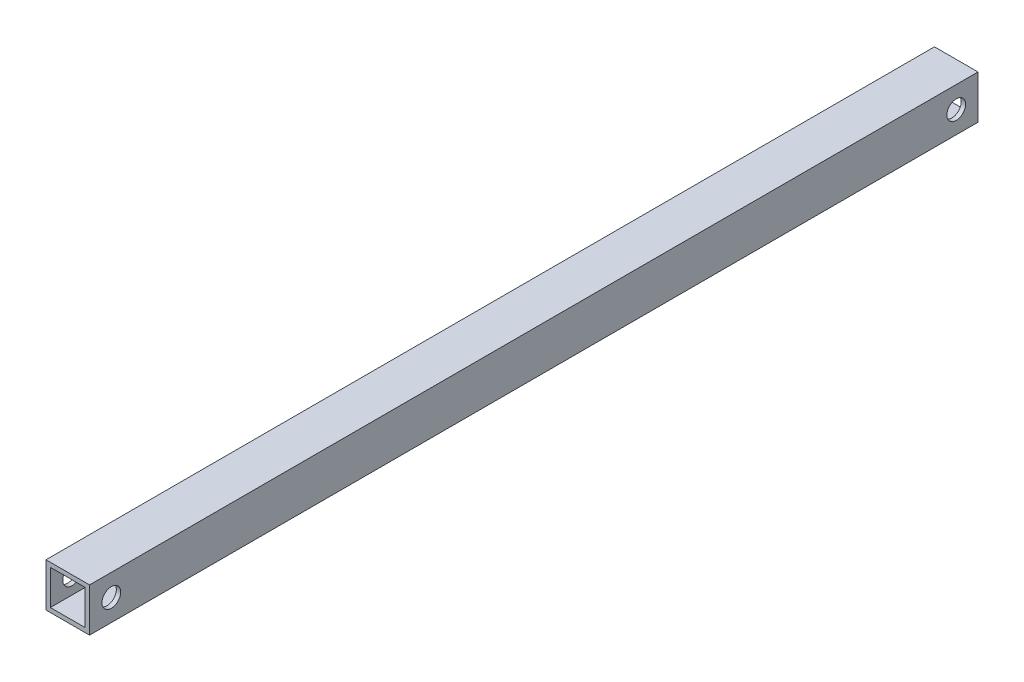
ISO-10303-21;
HEADER;
FILE_DESCRIPTION(('STEP AP214'),'2;1');
FILE_NAME('part.step','',(''),(''),'','','');
FILE_SCHEMA(('AUTOMOTIVE_DESIGN { 1 0 10303 214 1 1 1 1 }'));
ENDSEC;
DATA;
#1=APPLICATION_CONTEXT('core data for automotive mechanical design processes');
#2=APPLICATION_PROTOCOL_DEFINITION('international standard','automotive_design',2000,#1);
#3=PRODUCT_CONTEXT('',#1,'mechanical');
#4=PRODUCT('Part','Part','',(#3));
#5=PRODUCT_RELATED_PRODUCT_CATEGORY('part','',(#4));
#6=PRODUCT_DEFINITION_FORMATION('','',#4);
#7=PRODUCT_DEFINITION_CONTEXT('part definition',#1,'design');
#8=PRODUCT_DEFINITION('design','',#6,#7);
#9=PRODUCT_DEFINITION_SHAPE('','',#8);
#10=(LENGTH_UNIT() NAMED_UNIT(*) SI_UNIT(.MILLI.,.METRE.));
#11=(NAMED_UNIT(*) PLANE_ANGLE_UNIT() SI_UNIT($,.RADIAN.));
#12=(NAMED_UNIT(*) SI_UNIT($,.STERADIAN.) SOLID_ANGLE_UNIT());
#13=UNCERTAINTY_MEASURE_WITH_UNIT(LENGTH_MEASURE(1.E-05),#10,'distance_accuracy_value','');
#14=(GEOMETRIC_REPRESENTATION_CONTEXT(3) GLOBAL_UNCERTAINTY_ASSIGNED_CONTEXT((#13)) GLOBAL_UNIT_ASSIGNED_CONTEXT((#10,
#11,#12)) REPRESENTATION_CONTEXT('',''));
#15=CARTESIAN_POINT('',(0.,0.,0.));
#16=DIRECTION('',(0.,0.,1.));
#17=DIRECTION('',(1.,0.,0.));
#18=AXIS2_PLACEMENT_3D('',#15,#16,#17);
#19=CARTESIAN_POINT('',(0.,0.,204.));
#20=DIRECTION('',(0.,0.,1.));
#21=DIRECTION('',(1.,0.,0.));
#22=AXIS2_PLACEMENT_3D('',#19,#20,#21);
#23=PLANE('',#22);
#24=DIRECTION('',(0.,1.,0.));
#25=VECTOR('',#24,1.);
#26=CARTESIAN_POINT('',(5.,5.,204.));
#27=LINE('',#26,#25);
#28=CARTESIAN_POINT('',(5.,-5.,204.));
#29=VERTEX_POINT('',#28);
#30=CARTESIAN_POINT('',(5.,5.,204.));
#31=VERTEX_POINT('',#30);
#32=EDGE_CURVE('E164',#29,#31,#27,.T.);
#33=ORIENTED_EDGE('',*,*,#32,.T.);
#34=DIRECTION('',(-1.,0.,0.));
#35=VECTOR('',#34,1.);
#36=CARTESIAN_POINT('',(-5.,5.,204.));
#37=LINE('',#36,#35);
#38=CARTESIAN_POINT('',(-5.,5.,204.));
#39=VERTEX_POINT('',#38);
#40=EDGE_CURVE('E167',#31,#39,#37,.T.);
#41=ORIENTED_EDGE('',*,*,#40,.T.);
#42=DIRECTION('',(0.,-1.,0.));
#43=VECTOR('',#42,1.);
#44=CARTESIAN_POINT('',(-5.,5.,204.));
#45=LINE('',#44,#43);
#46=CARTESIAN_POINT('',(-5.,-5.,204.));
#47=VERTEX_POINT('',#46);
#48=EDGE_CURVE('E170',#39,#47,#45,.T.);
#49=ORIENTED_EDGE('',*,*,#48,.T.);
#50=DIRECTION('',(1.,0.,0.));
#51=VECTOR('',#50,1.);
#52=CARTESIAN_POINT('',(-5.,-5.,204.));
#53=LINE('',#52,#51);
#54=EDGE_CURVE('E172',#47,#29,#53,.T.);
#55=ORIENTED_EDGE('',*,*,#54,.T.);
#56=EDGE_LOOP('',(#33,#41,#49,#55));
#57=FACE_BOUND('',#56,.T.);
#58=DIRECTION('',(-1.,0.,0.));
#59=VECTOR('',#58,1.);
#60=CARTESIAN_POINT('',(-5.,4.,204.));
#61=LINE('',#60,#59);
#62=CARTESIAN_POINT('',(4.,4.,204.));
#63=VERTEX_POINT('',#62);
#64=CARTESIAN_POINT('',(-4.,4.,204.));
#65=VERTEX_POINT('',#64);
#66=EDGE_CURVE('E134',#63,#65,#61,.T.);
#67=ORIENTED_EDGE('',*,*,#66,.F.);
#68=DIRECTION('',(0.,1.,0.));
#69=VECTOR('',#68,1.);
#70=CARTESIAN_POINT('',(4.,5.,204.));
#71=LINE('',#70,#69);
#72=CARTESIAN_POINT('',(4.,-4.,204.));
#73=VERTEX_POINT('',#72);
#74=EDGE_CURVE('E126',#73,#63,#71,.T.);
#75=ORIENTED_EDGE('',*,*,#74,.F.);
#76=DIRECTION('',(1.,0.,0.));
#77=VECTOR('',#76,1.);
#78=CARTESIAN_POINT('',(-5.,-4.,204.));
#79=LINE('',#78,#77);
#80=CARTESIAN_POINT('',(-4.,-4.,204.));
#81=VERTEX_POINT('',#80);
#82=EDGE_CURVE('E148',#81,#73,#79,.T.);
#83=ORIENTED_EDGE('',*,*,#82,.F.);
#84=DIRECTION('',(0.,-1.,0.));
#85=VECTOR('',#84,1.);
#86=CARTESIAN_POINT('',(-4.,5.,204.));
#87=LINE('',#86,#85);
#88=EDGE_CURVE('E146',#65,#81,#87,.T.);
#89=ORIENTED_EDGE('',*,*,#88,.F.);
#90=EDGE_LOOP('',(#67,#75,#83,#89));
#91=FACE_BOUND('',#90,.T.);
#92=ADVANCED_FACE('F59',(#57,#91),#23,.T.);
#93=CARTESIAN_POINT('',(0.,0.,0.));
#94=DIRECTION('',(0.,0.,1.));
#95=DIRECTION('',(1.,0.,0.));
#96=AXIS2_PLACEMENT_3D('',#93,#94,#95);
#97=PLANE('',#96);
#98=DIRECTION('',(0.,1.,0.));
#99=VECTOR('',#98,1.);
#100=CARTESIAN_POINT('',(5.,5.,0.));
#101=LINE('',#100,#99);
#102=CARTESIAN_POINT('',(5.,-5.,0.));
#103=VERTEX_POINT('',#102);
#104=CARTESIAN_POINT('',(5.,5.,0.));
#105=VERTEX_POINT('',#104);
#106=EDGE_CURVE('E142',#103,#105,#101,.T.);
#107=ORIENTED_EDGE('',*,*,#106,.F.);
#108=DIRECTION('',(1.,0.,0.));
#109=VECTOR('',#108,1.);
#110=CARTESIAN_POINT('',(-5.,-5.,0.));
#111=LINE('',#110,#109);
#112=CARTESIAN_POINT('',(-5.,-5.,0.));
#113=VERTEX_POINT('',#112);
#114=EDGE_CURVE('E168',#113,#103,#111,.T.);
#115=ORIENTED_EDGE('',*,*,#114,.F.);
#116=DIRECTION('',(0.,-1.,0.));
#117=VECTOR('',#116,1.);
#118=CARTESIAN_POINT('',(-5.,5.,0.));
#119=LINE('',#118,#117);
#120=CARTESIAN_POINT('',(-5.,5.,0.));
#121=VERTEX_POINT('',#120);
#122=EDGE_CURVE('E179',#121,#113,#119,.T.);
#123=ORIENTED_EDGE('',*,*,#122,.F.);
#124=DIRECTION('',(-1.,0.,0.));
#125=VECTOR('',#124,1.);
#126=CARTESIAN_POINT('',(-5.,5.,0.));
#127=LINE('',#126,#125);
#128=EDGE_CURVE('E177',#105,#121,#127,.T.);
#129=ORIENTED_EDGE('',*,*,#128,.F.);
#130=EDGE_LOOP('',(#107,#115,#123,#129));
#131=FACE_BOUND('',#130,.T.);
#132=DIRECTION('',(0.,1.,0.));
#133=VECTOR('',#132,1.);
#134=CARTESIAN_POINT('',(4.,5.,0.));
#135=LINE('',#134,#133);
#136=CARTESIAN_POINT('',(4.,-4.,0.));
#137=VERTEX_POINT('',#136);
#138=CARTESIAN_POINT('',(4.,4.,0.));
#139=VERTEX_POINT('',#138);
#140=EDGE_CURVE('E84',#137,#139,#135,.T.);
#141=ORIENTED_EDGE('',*,*,#140,.T.);
#142=DIRECTION('',(-1.,0.,0.));
#143=VECTOR('',#142,1.);
#144=CARTESIAN_POINT('',(-5.,4.,0.));
#145=LINE('',#144,#143);
#146=CARTESIAN_POINT('',(-4.,4.,0.));
#147=VERTEX_POINT('',#146);
#148=EDGE_CURVE('E141',#139,#147,#145,.T.);
#149=ORIENTED_EDGE('',*,*,#148,.T.);
#150=DIRECTION('',(0.,-1.,0.));
#151=VECTOR('',#150,1.);
#152=CARTESIAN_POINT('',(-4.,5.,0.));
#153=LINE('',#152,#151);
#154=CARTESIAN_POINT('',(-4.,-4.,0.));
#155=VERTEX_POINT('',#154);
#156=EDGE_CURVE('E156',#147,#155,#153,.T.);
#157=ORIENTED_EDGE('',*,*,#156,.T.);
#158=DIRECTION('',(1.,0.,0.));
#159=VECTOR('',#158,1.);
#160=CARTESIAN_POINT('',(-5.,-4.,0.));
#161=LINE('',#160,#159);
#162=EDGE_CURVE('E135',#155,#137,#161,.T.);
#163=ORIENTED_EDGE('',*,*,#162,.T.);
#164=EDGE_LOOP('',(#141,#149,#157,#163));
#165=FACE_BOUND('',#164,.T.);
#166=ADVANCED_FACE('F226',(#131,#165),#97,.F.);
#167=CARTESIAN_POINT('',(5.,5.,204.));
#168=DIRECTION('',(-1.,0.,0.));
#169=DIRECTION('',(0.,-1.,0.));
#170=AXIS2_PLACEMENT_3D('',#167,#168,#169);
#171=PLANE('',#170);
#172=CARTESIAN_POINT('',(5.,0.,5.));
#173=DIRECTION('',(1.,0.,0.));
#174=DIRECTION('',(0.,1.,0.));
#175=AXIS2_PLACEMENT_3D('',#172,#173,#174);
#176=CIRCLE('',#175,2.15);
#177=CARTESIAN_POINT('',(5.,2.15,5.));
#178=VERTEX_POINT('',#177);
#179=EDGE_CURVE('E197',#178,#178,#176,.T.);
#180=ORIENTED_EDGE('',*,*,#179,.F.);
#181=EDGE_LOOP('',(#180));
#182=FACE_BOUND('',#181,.T.);
#183=CARTESIAN_POINT('',(5.,0.,199.));
#184=DIRECTION('',(1.,0.,0.));
#185=DIRECTION('',(0.,-1.,0.));
#186=AXIS2_PLACEMENT_3D('',#183,#184,#185);
#187=CIRCLE('',#186,2.15000000000002);
#188=CARTESIAN_POINT('',(5.,-2.15000000000004,199.));
#189=VERTEX_POINT('',#188);
#190=EDGE_CURVE('E207',#189,#189,#187,.T.);
#191=ORIENTED_EDGE('',*,*,#190,.F.);
#192=EDGE_LOOP('',(#191));
#193=FACE_BOUND('',#192,.T.);
#194=ORIENTED_EDGE('',*,*,#106,.T.);
#195=DIRECTION('',(0.,0.,-1.));
#196=VECTOR('',#195,1.);
#197=CARTESIAN_POINT('',(5.,5.,204.));
#198=LINE('',#197,#196);
#199=EDGE_CURVE('E12',#31,#105,#198,.T.);
#200=ORIENTED_EDGE('',*,*,#199,.F.);
#201=ORIENTED_EDGE('',*,*,#32,.F.);
#202=DIRECTION('',(0.,0.,-1.));
#203=VECTOR('',#202,1.);
#204=CARTESIAN_POINT('',(5.,-5.,204.));
#205=LINE('',#204,#203);
#206=EDGE_CURVE('E174',#29,#103,#205,.T.);
#207=ORIENTED_EDGE('',*,*,#206,.T.);
#208=EDGE_LOOP('',(#194,#200,#201,#207));
#209=FACE_BOUND('',#208,.T.);
#210=ADVANCED_FACE('F61',(#182,#193,#209),#171,.F.);
#211=CARTESIAN_POINT('',(-5.,5.,204.));
#212=DIRECTION('',(0.,-1.,0.));
#213=DIRECTION('',(0.,0.,-1.));
#214=AXIS2_PLACEMENT_3D('',#211,#212,#213);
#215=PLANE('',#214);
#216=ORIENTED_EDGE('',*,*,#128,.T.);
#217=DIRECTION('',(0.,0.,-1.));
#218=VECTOR('',#217,1.);
#219=CARTESIAN_POINT('',(-5.,5.,204.));
#220=LINE('',#219,#218);
#221=EDGE_CURVE('E68',#39,#121,#220,.T.);
#222=ORIENTED_EDGE('',*,*,#221,.F.);
#223=ORIENTED_EDGE('',*,*,#40,.F.);
#224=ORIENTED_EDGE('',*,*,#199,.T.);
#225=EDGE_LOOP('',(#216,#222,#223,#224));
#226=FACE_BOUND('',#225,.T.);
#227=ADVANCED_FACE('F252',(#226),#215,.F.);
#228=CARTESIAN_POINT('',(-5.,5.,204.));
#229=DIRECTION('',(1.,0.,0.));
#230=DIRECTION('',(0.,1.,0.));
#231=AXIS2_PLACEMENT_3D('',#228,#229,#230);
#232=PLANE('',#231);
#233=CARTESIAN_POINT('',(-5.,0.,5.));
#234=DIRECTION('',(1.,0.,0.));
#235=DIRECTION('',(0.,1.,0.));
#236=AXIS2_PLACEMENT_3D('',#233,#234,#235);
#237=CIRCLE('',#236,2.15);
#238=CARTESIAN_POINT('',(-5.,2.15,5.));
#239=VERTEX_POINT('',#238);
#240=EDGE_CURVE('E191',#239,#239,#237,.T.);
#241=ORIENTED_EDGE('',*,*,#240,.T.);
#242=EDGE_LOOP('',(#241));
#243=FACE_BOUND('',#242,.T.);
#244=CARTESIAN_POINT('',(-5.,0.,199.));
#245=DIRECTION('',(1.,0.,0.));
#246=DIRECTION('',(0.,-1.,0.));
#247=AXIS2_PLACEMENT_3D('',#244,#245,#246);
#248=CIRCLE('',#247,2.15000000000002);
#249=CARTESIAN_POINT('',(-5.,-2.15000000000004,199.));
#250=VERTEX_POINT('',#249);
#251=EDGE_CURVE('E202',#250,#250,#248,.T.);
#252=ORIENTED_EDGE('',*,*,#251,.T.);
#253=EDGE_LOOP('',(#252));
#254=FACE_BOUND('',#253,.T.);
#255=ORIENTED_EDGE('',*,*,#122,.T.);
#256=DIRECTION('',(0.,0.,-1.));
#257=VECTOR('',#256,1.);
#258=CARTESIAN_POINT('',(-5.,-5.,204.));
#259=LINE('',#258,#257);
#260=EDGE_CURVE('E184',#47,#113,#259,.T.);
#261=ORIENTED_EDGE('',*,*,#260,.F.);
#262=ORIENTED_EDGE('',*,*,#48,.F.);
#263=ORIENTED_EDGE('',*,*,#221,.T.);
#264=EDGE_LOOP('',(#255,#261,#262,#263));
#265=FACE_BOUND('',#264,.T.);
#266=ADVANCED_FACE('F249',(#243,#254,#265),#232,.F.);
#267=CARTESIAN_POINT('',(-5.,-5.,204.));
#268=DIRECTION('',(0.,1.,0.));
#269=DIRECTION('',(0.,0.,1.));
#270=AXIS2_PLACEMENT_3D('',#267,#268,#269);
#271=PLANE('',#270);
#272=ORIENTED_EDGE('',*,*,#114,.T.);
#273=ORIENTED_EDGE('',*,*,#206,.F.);
#274=ORIENTED_EDGE('',*,*,#54,.F.);
#275=ORIENTED_EDGE('',*,*,#260,.T.);
#276=EDGE_LOOP('',(#272,#273,#274,#275));
#277=FACE_BOUND('',#276,.T.);
#278=ADVANCED_FACE('F246',(#277),#271,.F.);
#279=CARTESIAN_POINT('',(4.,5.,204.));
#280=DIRECTION('',(-1.,0.,0.));
#281=DIRECTION('',(0.,-1.,0.));
#282=AXIS2_PLACEMENT_3D('',#279,#280,#281);
#283=PLANE('',#282);
#284=CARTESIAN_POINT('',(4.,0.,5.));
#285=DIRECTION('',(-1.,0.,0.));
#286=DIRECTION('',(0.,-1.,0.));
#287=AXIS2_PLACEMENT_3D('',#284,#285,#286);
#288=CIRCLE('',#287,2.15);
#289=CARTESIAN_POINT('',(4.,-2.15,5.));
#290=VERTEX_POINT('',#289);
#291=EDGE_CURVE('E154',#290,#290,#288,.T.);
#292=ORIENTED_EDGE('',*,*,#291,.F.);
#293=EDGE_LOOP('',(#292));
#294=FACE_BOUND('',#293,.T.);
#295=CARTESIAN_POINT('',(4.,0.,199.));
#296=DIRECTION('',(-1.,0.,0.));
#297=DIRECTION('',(0.,-1.,0.));
#298=AXIS2_PLACEMENT_3D('',#295,#296,#297);
#299=CIRCLE('',#298,2.15000000000002);
#300=CARTESIAN_POINT('',(4.,-2.15000000000004,199.));
#301=VERTEX_POINT('',#300);
#302=EDGE_CURVE('E190',#301,#301,#299,.T.);
#303=ORIENTED_EDGE('',*,*,#302,.F.);
#304=EDGE_LOOP('',(#303));
#305=FACE_BOUND('',#304,.T.);
#306=ORIENTED_EDGE('',*,*,#140,.F.);
#307=DIRECTION('',(0.,0.,-1.));
#308=VECTOR('',#307,1.);
#309=CARTESIAN_POINT('',(4.,-4.,204.));
#310=LINE('',#309,#308);
#311=EDGE_CURVE('E130',#73,#137,#310,.T.);
#312=ORIENTED_EDGE('',*,*,#311,.F.);
#313=ORIENTED_EDGE('',*,*,#74,.T.);
#314=DIRECTION('',(0.,0.,-1.));
#315=VECTOR('',#314,1.);
#316=CARTESIAN_POINT('',(4.,4.,204.));
#317=LINE('',#316,#315);
#318=EDGE_CURVE('E129',#63,#139,#317,.T.);
#319=ORIENTED_EDGE('',*,*,#318,.T.);
#320=EDGE_LOOP('',(#306,#312,#313,#319));
#321=FACE_BOUND('',#320,.T.);
#322=ADVANCED_FACE('F128',(#294,#305,#321),#283,.T.);
#323=CARTESIAN_POINT('',(-5.,4.,204.));
#324=DIRECTION('',(0.,-1.,0.));
#325=DIRECTION('',(0.,0.,-1.));
#326=AXIS2_PLACEMENT_3D('',#323,#324,#325);
#327=PLANE('',#326);
#328=ORIENTED_EDGE('',*,*,#148,.F.);
#329=ORIENTED_EDGE('',*,*,#318,.F.);
#330=ORIENTED_EDGE('',*,*,#66,.T.);
#331=DIRECTION('',(0.,0.,-1.));
#332=VECTOR('',#331,1.);
#333=CARTESIAN_POINT('',(-4.,4.,204.));
#334=LINE('',#333,#332);
#335=EDGE_CURVE('E143',#65,#147,#334,.T.);
#336=ORIENTED_EDGE('',*,*,#335,.T.);
#337=EDGE_LOOP('',(#328,#329,#330,#336));
#338=FACE_BOUND('',#337,.T.);
#339=ADVANCED_FACE('F138',(#338),#327,.T.);
#340=CARTESIAN_POINT('',(-4.,5.,204.));
#341=DIRECTION('',(1.,0.,0.));
#342=DIRECTION('',(0.,1.,0.));
#343=AXIS2_PLACEMENT_3D('',#340,#341,#342);
#344=PLANE('',#343);
#345=CARTESIAN_POINT('',(-4.,0.,5.));
#346=DIRECTION('',(1.,0.,0.));
#347=DIRECTION('',(0.,1.,0.));
#348=AXIS2_PLACEMENT_3D('',#345,#346,#347);
#349=CIRCLE('',#348,2.15);
#350=CARTESIAN_POINT('',(-4.,2.15,5.));
#351=VERTEX_POINT('',#350);
#352=EDGE_CURVE('E63',#351,#351,#349,.T.);
#353=ORIENTED_EDGE('',*,*,#352,.F.);
#354=EDGE_LOOP('',(#353));
#355=FACE_BOUND('',#354,.T.);
#356=CARTESIAN_POINT('',(-4.,0.,199.));
#357=DIRECTION('',(1.,0.,0.));
#358=DIRECTION('',(0.,1.,0.));
#359=AXIS2_PLACEMENT_3D('',#356,#357,#358);
#360=CIRCLE('',#359,2.15000000000002);
#361=CARTESIAN_POINT('',(-4.,2.14999999999999,199.));
#362=VERTEX_POINT('',#361);
#363=EDGE_CURVE('E188',#362,#362,#360,.T.);
#364=ORIENTED_EDGE('',*,*,#363,.F.);
#365=EDGE_LOOP('',(#364));
#366=FACE_BOUND('',#365,.T.);
#367=ORIENTED_EDGE('',*,*,#156,.F.);
#368=ORIENTED_EDGE('',*,*,#335,.F.);
#369=ORIENTED_EDGE('',*,*,#88,.T.);
#370=DIRECTION('',(0.,0.,-1.));
#371=VECTOR('',#370,1.);
#372=CARTESIAN_POINT('',(-4.,-4.,204.));
#373=LINE('',#372,#371);
#374=EDGE_CURVE('E76',#81,#155,#373,.T.);
#375=ORIENTED_EDGE('',*,*,#374,.T.);
#376=EDGE_LOOP('',(#367,#368,#369,#375));
#377=FACE_BOUND('',#376,.T.);
#378=ADVANCED_FACE('F218',(#355,#366,#377),#344,.T.);
#379=CARTESIAN_POINT('',(-5.,-4.,204.));
#380=DIRECTION('',(0.,1.,0.));
#381=DIRECTION('',(0.,0.,1.));
#382=AXIS2_PLACEMENT_3D('',#379,#380,#381);
#383=PLANE('',#382);
#384=ORIENTED_EDGE('',*,*,#162,.F.);
#385=ORIENTED_EDGE('',*,*,#374,.F.);
#386=ORIENTED_EDGE('',*,*,#82,.T.);
#387=ORIENTED_EDGE('',*,*,#311,.T.);
#388=EDGE_LOOP('',(#384,#385,#386,#387));
#389=FACE_BOUND('',#388,.T.);
#390=ADVANCED_FACE('F221',(#389),#383,.T.);
#391=CARTESIAN_POINT('',(-5.,0.,199.));
#392=DIRECTION('',(1.,0.,0.));
#393=DIRECTION('',(0.,1.,0.));
#394=AXIS2_PLACEMENT_3D('',#391,#392,#393);
#395=CYLINDRICAL_SURFACE('',#394,2.15000000000002);
#396=ORIENTED_EDGE('',*,*,#363,.T.);
#397=EDGE_LOOP('',(#396));
#398=FACE_BOUND('',#397,.T.);
#399=ORIENTED_EDGE('',*,*,#251,.F.);
#400=EDGE_LOOP('',(#399));
#401=FACE_BOUND('',#400,.T.);
#402=ADVANCED_FACE('F228',(#398,#401),#395,.F.);
#403=CARTESIAN_POINT('',(-5.,0.,5.));
#404=DIRECTION('',(1.,0.,0.));
#405=DIRECTION('',(0.,1.,0.));
#406=AXIS2_PLACEMENT_3D('',#403,#404,#405);
#407=CYLINDRICAL_SURFACE('',#406,2.15);
#408=ORIENTED_EDGE('',*,*,#352,.T.);
#409=EDGE_LOOP('',(#408));
#410=FACE_BOUND('',#409,.T.);
#411=ORIENTED_EDGE('',*,*,#240,.F.);
#412=EDGE_LOOP('',(#411));
#413=FACE_BOUND('',#412,.T.);
#414=ADVANCED_FACE('F215',(#410,#413),#407,.F.);
#415=ORIENTED_EDGE('',*,*,#302,.T.);
#416=EDGE_LOOP('',(#415));
#417=FACE_BOUND('',#416,.T.);
#418=ORIENTED_EDGE('',*,*,#190,.T.);
#419=EDGE_LOOP('',(#418));
#420=FACE_BOUND('',#419,.T.);
#421=ADVANCED_FACE('F234',(#417,#420),#395,.F.);
#422=ORIENTED_EDGE('',*,*,#291,.T.);
#423=EDGE_LOOP('',(#422));
#424=FACE_BOUND('',#423,.T.);
#425=ORIENTED_EDGE('',*,*,#179,.T.);
#426=EDGE_LOOP('',(#425));
#427=FACE_BOUND('',#426,.T.);
#428=ADVANCED_FACE('F278',(#424,#427),#407,.F.);
#429=CLOSED_SHELL('',(#92,#166,#210,#227,#266,#278,#322,#339,#378,#390,#402,#414,#421,#428));
#430=MANIFOLD_SOLID_BREP('B2',#429);
#431=ADVANCED_BREP_SHAPE_REPRESENTATION('',(#18,#430),#14);
#432=SHAPE_DEFINITION_REPRESENTATION(#9,#431);
ENDSEC;
END-ISO-10303-21;
